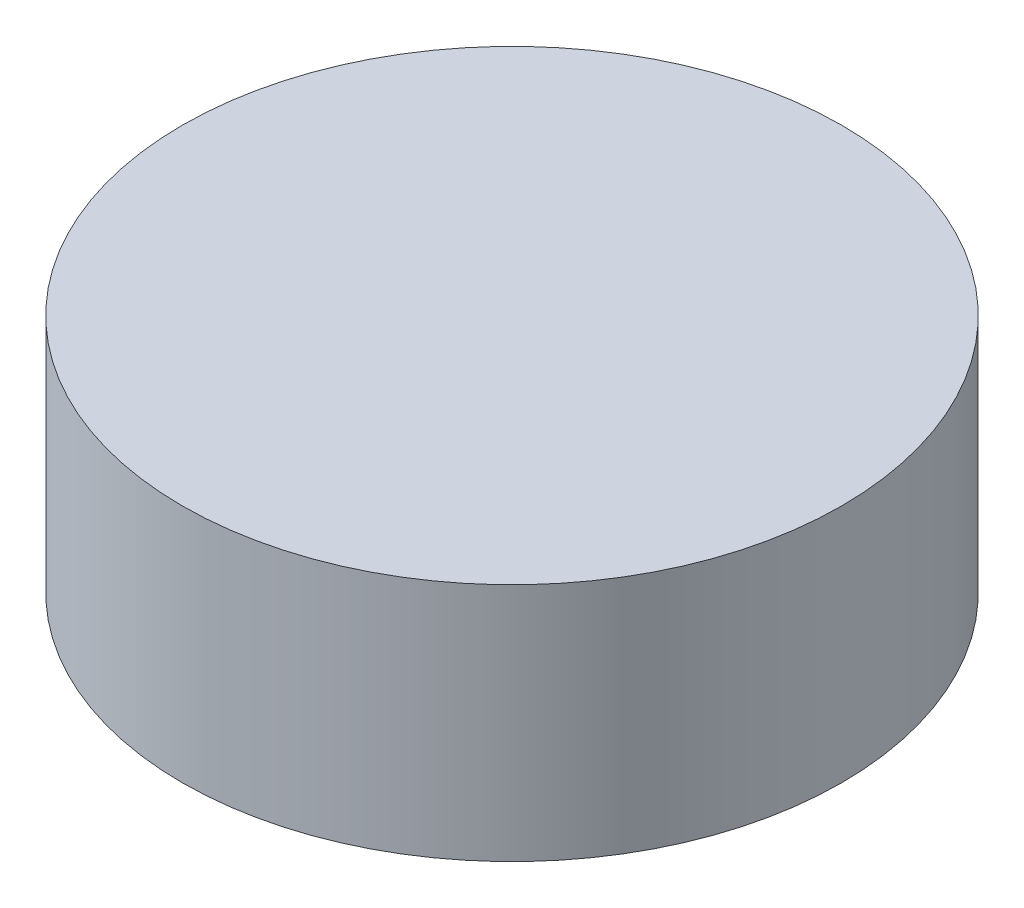
ISO-10303-21;
HEADER;
FILE_DESCRIPTION(('STEP AP214'),'2;1');
FILE_NAME('part.step','',(''),(''),'','','');
FILE_SCHEMA(('AUTOMOTIVE_DESIGN { 1 0 10303 214 1 1 1 1 }'));
ENDSEC;
DATA;
#1=APPLICATION_CONTEXT('core data for automotive mechanical design processes');
#2=APPLICATION_PROTOCOL_DEFINITION('international standard','automotive_design',2000,#1);
#3=PRODUCT_CONTEXT('',#1,'mechanical');
#4=PRODUCT('Part','Part','',(#3));
#5=PRODUCT_RELATED_PRODUCT_CATEGORY('part','',(#4));
#6=PRODUCT_DEFINITION_FORMATION('','',#4);
#7=PRODUCT_DEFINITION_CONTEXT('part definition',#1,'design');
#8=PRODUCT_DEFINITION('design','',#6,#7);
#9=PRODUCT_DEFINITION_SHAPE('','',#8);
#10=(LENGTH_UNIT() NAMED_UNIT(*) SI_UNIT(.MILLI.,.METRE.));
#11=(NAMED_UNIT(*) PLANE_ANGLE_UNIT() SI_UNIT($,.RADIAN.));
#12=(NAMED_UNIT(*) SI_UNIT($,.STERADIAN.) SOLID_ANGLE_UNIT());
#13=UNCERTAINTY_MEASURE_WITH_UNIT(LENGTH_MEASURE(1.E-05),#10,'distance_accuracy_value','');
#14=(GEOMETRIC_REPRESENTATION_CONTEXT(3) GLOBAL_UNCERTAINTY_ASSIGNED_CONTEXT((#13)) GLOBAL_UNIT_ASSIGNED_CONTEXT((#10,
#11,#12)) REPRESENTATION_CONTEXT('',''));
#15=CARTESIAN_POINT('',(0.,0.,0.));
#16=DIRECTION('',(0.,0.,1.));
#17=DIRECTION('',(1.,0.,0.));
#18=AXIS2_PLACEMENT_3D('',#15,#16,#17);
#19=CARTESIAN_POINT('',(0.,4.,0.));
#20=DIRECTION('',(0.,-1.,0.));
#21=DIRECTION('',(0.,0.,-1.));
#22=AXIS2_PLACEMENT_3D('',#19,#20,#21);
#23=CYLINDRICAL_SURFACE('',#22,5.5);
#24=CARTESIAN_POINT('',(0.,4.,0.));
#25=DIRECTION('',(0.,1.,0.));
#26=DIRECTION('',(0.,0.,1.));
#27=AXIS2_PLACEMENT_3D('',#24,#25,#26);
#28=CIRCLE('',#27,5.5);
#29=CARTESIAN_POINT('',(0.,4.,5.5));
#30=VERTEX_POINT('',#29);
#31=EDGE_CURVE('E10',#30,#30,#28,.T.);
#32=ORIENTED_EDGE('',*,*,#31,.F.);
#33=EDGE_LOOP('',(#32));
#34=FACE_BOUND('',#33,.T.);
#35=CARTESIAN_POINT('',(0.,0.,0.));
#36=DIRECTION('',(0.,1.,0.));
#37=DIRECTION('',(0.,0.,1.));
#38=AXIS2_PLACEMENT_3D('',#35,#36,#37);
#39=CIRCLE('',#38,5.5);
#40=CARTESIAN_POINT('',(0.,0.,5.5));
#41=VERTEX_POINT('',#40);
#42=EDGE_CURVE('E44',#41,#41,#39,.T.);
#43=ORIENTED_EDGE('',*,*,#42,.T.);
#44=EDGE_LOOP('',(#43));
#45=FACE_BOUND('',#44,.T.);
#46=ADVANCED_FACE('F41',(#34,#45),#23,.T.);
#47=CARTESIAN_POINT('',(0.,4.,0.));
#48=DIRECTION('',(0.,1.,0.));
#49=DIRECTION('',(0.,0.,1.));
#50=AXIS2_PLACEMENT_3D('',#47,#48,#49);
#51=PLANE('',#50);
#52=ORIENTED_EDGE('',*,*,#31,.T.);
#53=EDGE_LOOP('',(#52));
#54=FACE_BOUND('',#53,.T.);
#55=ADVANCED_FACE('F58',(#54),#51,.T.);
#56=CARTESIAN_POINT('',(0.,0.,0.));
#57=DIRECTION('',(0.,1.,0.));
#58=DIRECTION('',(0.,0.,1.));
#59=AXIS2_PLACEMENT_3D('',#56,#57,#58);
#60=PLANE('',#59);
#61=ORIENTED_EDGE('',*,*,#42,.F.);
#62=EDGE_LOOP('',(#61));
#63=FACE_BOUND('',#62,.T.);
#64=ADVANCED_FACE('F56',(#63),#60,.F.);
#65=CLOSED_SHELL('',(#46,#55,#64));
#66=MANIFOLD_SOLID_BREP('B2',#65);
#67=ADVANCED_BREP_SHAPE_REPRESENTATION('',(#18,#66),#14);
#68=SHAPE_DEFINITION_REPRESENTATION(#9,#67);
ENDSEC;
END-ISO-10303-21;
